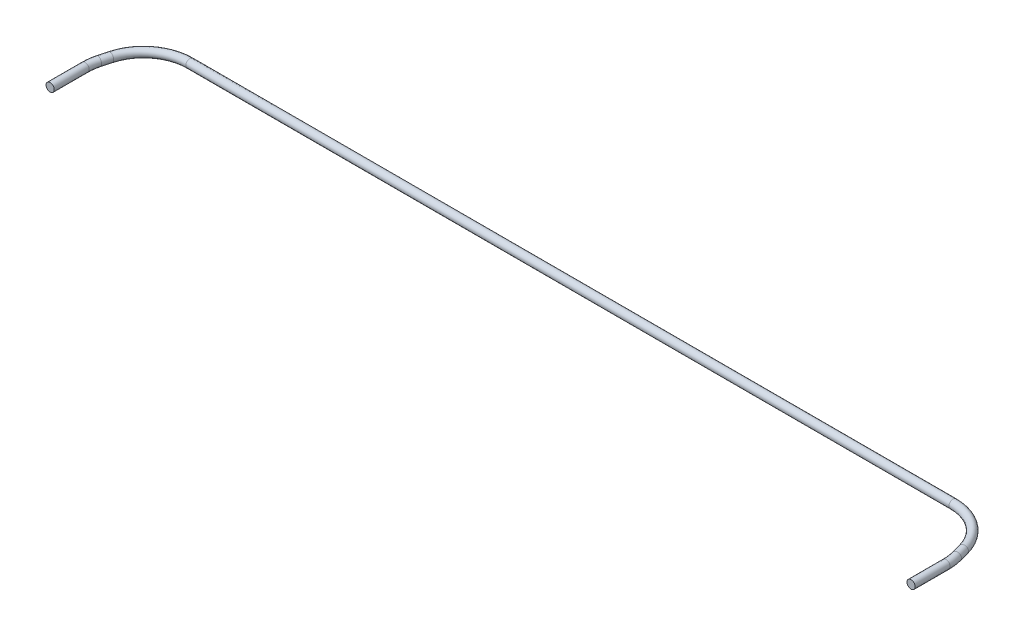
ISO-10303-21;
HEADER;
FILE_DESCRIPTION(('STEP AP214'),'2;1');
FILE_NAME('part.step','',(''),(''),'','','');
FILE_SCHEMA(('AUTOMOTIVE_DESIGN { 1 0 10303 214 1 1 1 1 }'));
ENDSEC;
DATA;
#1=APPLICATION_CONTEXT('core data for automotive mechanical design processes');
#2=APPLICATION_PROTOCOL_DEFINITION('international standard','automotive_design',2000,#1);
#3=PRODUCT_CONTEXT('',#1,'mechanical');
#4=PRODUCT('Part','Part','',(#3));
#5=PRODUCT_RELATED_PRODUCT_CATEGORY('part','',(#4));
#6=PRODUCT_DEFINITION_FORMATION('','',#4);
#7=PRODUCT_DEFINITION_CONTEXT('part definition',#1,'design');
#8=PRODUCT_DEFINITION('design','',#6,#7);
#9=PRODUCT_DEFINITION_SHAPE('','',#8);
#10=(LENGTH_UNIT() NAMED_UNIT(*) SI_UNIT(.MILLI.,.METRE.));
#11=(NAMED_UNIT(*) PLANE_ANGLE_UNIT() SI_UNIT($,.RADIAN.));
#12=(NAMED_UNIT(*) SI_UNIT($,.STERADIAN.) SOLID_ANGLE_UNIT());
#13=UNCERTAINTY_MEASURE_WITH_UNIT(LENGTH_MEASURE(1.E-05),#10,'distance_accuracy_value','');
#14=(GEOMETRIC_REPRESENTATION_CONTEXT(3) GLOBAL_UNCERTAINTY_ASSIGNED_CONTEXT((#13)) GLOBAL_UNIT_ASSIGNED_CONTEXT((#10,
#11,#12)) REPRESENTATION_CONTEXT('',''));
#15=CARTESIAN_POINT('',(0.,0.,0.));
#16=DIRECTION('',(0.,0.,1.));
#17=DIRECTION('',(1.,0.,0.));
#18=AXIS2_PLACEMENT_3D('',#15,#16,#17);
#19=CARTESIAN_POINT('',(135.392107577293,0.,26.));
#20=DIRECTION('',(0.,0.,1.));
#21=DIRECTION('',(1.,0.,0.));
#22=AXIS2_PLACEMENT_3D('',#19,#20,#21);
#23=PLANE('',#22);
#24=CARTESIAN_POINT('',(135.392107577293,0.,26.));
#25=DIRECTION('',(0.,0.,1.));
#26=DIRECTION('',(1.,0.,0.));
#27=AXIS2_PLACEMENT_3D('',#24,#25,#26);
#28=CIRCLE('',#27,1.29413);
#29=CARTESIAN_POINT('',(136.686237577293,0.,26.));
#30=VERTEX_POINT('',#29);
#31=EDGE_CURVE('E55',#30,#30,#28,.T.);
#32=ORIENTED_EDGE('',*,*,#31,.T.);
#33=EDGE_LOOP('',(#32));
#34=FACE_BOUND('',#33,.T.);
#35=ADVANCED_FACE('F36',(#34),#23,.T.);
#36=CARTESIAN_POINT('',(135.392107577293,0.,26.));
#37=DIRECTION('',(0.,0.,-1.));
#38=DIRECTION('',(-1.,0.,0.));
#39=AXIS2_PLACEMENT_3D('',#36,#37,#38);
#40=CYLINDRICAL_SURFACE('',#39,1.29413);
#41=CARTESIAN_POINT('',(135.392107577293,0.,15.));
#42=DIRECTION('',(0.,0.,1.));
#43=DIRECTION('',(1.,0.,0.));
#44=AXIS2_PLACEMENT_3D('',#41,#42,#43);
#45=CIRCLE('',#44,1.29413);
#46=CARTESIAN_POINT('',(136.686237577293,0.,15.));
#47=VERTEX_POINT('',#46);
#48=EDGE_CURVE('E50',#47,#47,#45,.T.);
#49=ORIENTED_EDGE('',*,*,#48,.T.);
#50=EDGE_LOOP('',(#49));
#51=FACE_BOUND('',#50,.T.);
#52=ORIENTED_EDGE('',*,*,#31,.F.);
#53=EDGE_LOOP('',(#52));
#54=FACE_BOUND('',#53,.T.);
#55=ADVANCED_FACE('F105',(#51,#54),#40,.T.);
#56=CARTESIAN_POINT('',(120.803847577293,0.,15.));
#57=DIRECTION('',(0.,1.,0.));
#58=DIRECTION('',(0.,0.,1.));
#59=AXIS2_PLACEMENT_3D('',#56,#57,#58);
#60=TOROIDAL_SURFACE('',#59,14.58826,1.29413);
#61=CARTESIAN_POINT('',(134.895024671913,0.,11.2242804770927));
#62=DIRECTION('',(0.258819045102518,0.,0.965925826289069));
#63=DIRECTION('',(0.965925826289069,0.,-0.258819045102518));
#64=AXIS2_PLACEMENT_3D('',#61,#62,#63);
#65=CIRCLE('',#64,1.29413);
#66=CARTESIAN_POINT('',(136.145058261489,0.,10.8893349862542));
#67=VERTEX_POINT('',#66);
#68=EDGE_CURVE('E46',#67,#67,#65,.T.);
#69=CARTESIAN_POINT('',(120.803847577293,0.,15.));
#70=DIRECTION('',(0.,1.,0.));
#71=DIRECTION('',(0.,0.,1.));
#72=AXIS2_PLACEMENT_3D('',#69,#70,#71);
#73=CIRCLE('',#72,15.88239);
#74=EDGE_CURVE('',#47,#67,#73,.T.);
#75=ORIENTED_EDGE('',*,*,#48,.F.);
#76=ORIENTED_EDGE('',*,*,#68,.T.);
#77=ORIENTED_EDGE('',*,*,#74,.T.);
#78=ORIENTED_EDGE('',*,*,#74,.F.);
#79=EDGE_LOOP('',(#75,#77,#76,#78));
#80=FACE_BOUND('',#79,.T.);
#81=ADVANCED_FACE('F102',(#80),#60,.T.);
#82=CARTESIAN_POINT('',(134.895024671913,0.,11.2242804770927));
#83=DIRECTION('',(-0.258819045102523,0.,-0.965925826289068));
#84=DIRECTION('',(-0.965925826289068,0.,0.258819045102523));
#85=AXIS2_PLACEMENT_3D('',#82,#83,#84);
#86=CYLINDRICAL_SURFACE('',#85,1.29413);
#87=CARTESIAN_POINT('',(134.09117709462,0.,8.22428047709274));
#88=DIRECTION('',(0.258819045102523,0.,0.965925826289068));
#89=DIRECTION('',(0.965925826289068,0.,-0.258819045102523));
#90=AXIS2_PLACEMENT_3D('',#87,#88,#89);
#91=CIRCLE('',#90,1.29413);
#92=CARTESIAN_POINT('',(135.341210684195,0.,7.88933498625422));
#93=VERTEX_POINT('',#92);
#94=EDGE_CURVE('E42',#93,#93,#91,.T.);
#95=ORIENTED_EDGE('',*,*,#94,.T.);
#96=EDGE_LOOP('',(#95));
#97=FACE_BOUND('',#96,.T.);
#98=ORIENTED_EDGE('',*,*,#68,.F.);
#99=EDGE_LOOP('',(#98));
#100=FACE_BOUND('',#99,.T.);
#101=ADVANCED_FACE('F96',(#97,#100),#86,.T.);
#102=CARTESIAN_POINT('',(120.,0.,12.));
#103=DIRECTION('',(0.,1.,0.));
#104=DIRECTION('',(0.,0.,1.));
#105=AXIS2_PLACEMENT_3D('',#102,#103,#104);
#106=TOROIDAL_SURFACE('',#105,14.58826,1.29413);
#107=CARTESIAN_POINT('',(120.,0.,-2.58826000000001));
#108=DIRECTION('',(1.,0.,0.));
#109=DIRECTION('',(0.,0.,-1.));
#110=AXIS2_PLACEMENT_3D('',#107,#108,#109);
#111=CIRCLE('',#110,1.29413);
#112=CARTESIAN_POINT('',(120.,0.,-3.88239000000001));
#113=VERTEX_POINT('',#112);
#114=EDGE_CURVE('E10',#113,#113,#111,.T.);
#115=CARTESIAN_POINT('',(120.,0.,12.));
#116=DIRECTION('',(0.,1.,0.));
#117=DIRECTION('',(0.,0.,1.));
#118=AXIS2_PLACEMENT_3D('',#115,#116,#117);
#119=CIRCLE('',#118,15.88239);
#120=EDGE_CURVE('',#93,#113,#119,.T.);
#121=ORIENTED_EDGE('',*,*,#94,.F.);
#122=ORIENTED_EDGE('',*,*,#114,.T.);
#123=ORIENTED_EDGE('',*,*,#120,.T.);
#124=ORIENTED_EDGE('',*,*,#120,.F.);
#125=EDGE_LOOP('',(#121,#123,#122,#124));
#126=FACE_BOUND('',#125,.T.);
#127=ADVANCED_FACE('F91',(#126),#106,.T.);
#128=CARTESIAN_POINT('',(120.,0.,-2.58826));
#129=DIRECTION('',(-1.,0.,0.));
#130=DIRECTION('',(0.,0.,1.));
#131=AXIS2_PLACEMENT_3D('',#128,#129,#130);
#132=CYLINDRICAL_SURFACE('',#131,1.29413);
#133=ORIENTED_EDGE('',*,*,#114,.F.);
#134=EDGE_LOOP('',(#133));
#135=FACE_BOUND('',#134,.T.);
#136=CARTESIAN_POINT('',(-120.,0.,-2.58826000000001));
#137=DIRECTION('',(1.,0.,0.));
#138=DIRECTION('',(0.,0.,-1.));
#139=AXIS2_PLACEMENT_3D('',#136,#137,#138);
#140=CIRCLE('',#139,1.29413);
#141=CARTESIAN_POINT('',(-120.,0.,-3.88239000000001));
#142=VERTEX_POINT('',#141);
#143=EDGE_CURVE('E58',#142,#142,#140,.F.);
#144=ORIENTED_EDGE('',*,*,#143,.F.);
#145=EDGE_LOOP('',(#144));
#146=FACE_BOUND('',#145,.T.);
#147=ADVANCED_FACE('F88',(#135,#146),#132,.T.);
#148=CARTESIAN_POINT('',(-135.392107577293,0.,26.));
#149=DIRECTION('',(0.,0.,1.));
#150=DIRECTION('',(-1.,0.,0.));
#151=AXIS2_PLACEMENT_3D('',#148,#149,#150);
#152=PLANE('',#151);
#153=CARTESIAN_POINT('',(-135.392107577293,0.,26.));
#154=DIRECTION('',(0.,0.,-1.));
#155=DIRECTION('',(-1.,0.,0.));
#156=AXIS2_PLACEMENT_3D('',#153,#154,#155);
#157=CIRCLE('',#156,1.29413);
#158=CARTESIAN_POINT('',(-136.686237577293,0.,26.));
#159=VERTEX_POINT('',#158);
#160=EDGE_CURVE('E70',#159,#159,#157,.F.);
#161=ORIENTED_EDGE('',*,*,#160,.T.);
#162=EDGE_LOOP('',(#161));
#163=FACE_BOUND('',#162,.T.);
#164=ADVANCED_FACE('F74',(#163),#152,.T.);
#165=CARTESIAN_POINT('',(-135.392107577293,0.,26.));
#166=DIRECTION('',(0.,0.,-1.));
#167=DIRECTION('',(-1.,0.,0.));
#168=AXIS2_PLACEMENT_3D('',#165,#166,#167);
#169=CYLINDRICAL_SURFACE('',#168,1.29413);
#170=CARTESIAN_POINT('',(-135.392107577293,0.,15.));
#171=DIRECTION('',(0.,0.,-1.));
#172=DIRECTION('',(-1.,0.,0.));
#173=AXIS2_PLACEMENT_3D('',#170,#171,#172);
#174=CIRCLE('',#173,1.29413);
#175=CARTESIAN_POINT('',(-136.686237577293,0.,15.));
#176=VERTEX_POINT('',#175);
#177=EDGE_CURVE('E67',#176,#176,#174,.F.);
#178=ORIENTED_EDGE('',*,*,#177,.T.);
#179=EDGE_LOOP('',(#178));
#180=FACE_BOUND('',#179,.T.);
#181=ORIENTED_EDGE('',*,*,#160,.F.);
#182=EDGE_LOOP('',(#181));
#183=FACE_BOUND('',#182,.T.);
#184=ADVANCED_FACE('F76',(#180,#183),#169,.T.);
#185=CARTESIAN_POINT('',(-120.803847577293,0.,15.));
#186=DIRECTION('',(0.,-1.,0.));
#187=DIRECTION('',(0.,0.,-1.));
#188=AXIS2_PLACEMENT_3D('',#185,#186,#187);
#189=TOROIDAL_SURFACE('',#188,14.58826,1.29413);
#190=CARTESIAN_POINT('',(-134.895024671913,0.,11.2242804770927));
#191=DIRECTION('',(0.258819045102518,0.,-0.965925826289069));
#192=DIRECTION('',(-0.965925826289069,0.,-0.258819045102518));
#193=AXIS2_PLACEMENT_3D('',#190,#191,#192);
#194=CIRCLE('',#193,1.29413);
#195=CARTESIAN_POINT('',(-136.145058261489,0.,10.8893349862542));
#196=VERTEX_POINT('',#195);
#197=EDGE_CURVE('E64',#196,#196,#194,.F.);
#198=CARTESIAN_POINT('',(-120.803847577293,0.,15.));
#199=DIRECTION('',(0.,-1.,0.));
#200=DIRECTION('',(0.,0.,-1.));
#201=AXIS2_PLACEMENT_3D('',#198,#199,#200);
#202=CIRCLE('',#201,15.88239);
#203=EDGE_CURVE('',#176,#196,#202,.T.);
#204=ORIENTED_EDGE('',*,*,#177,.F.);
#205=ORIENTED_EDGE('',*,*,#197,.T.);
#206=ORIENTED_EDGE('',*,*,#203,.T.);
#207=ORIENTED_EDGE('',*,*,#203,.F.);
#208=EDGE_LOOP('',(#204,#206,#205,#207));
#209=FACE_BOUND('',#208,.T.);
#210=ADVANCED_FACE('F78',(#209),#189,.T.);
#211=CARTESIAN_POINT('',(-134.895024671913,0.,11.2242804770927));
#212=DIRECTION('',(0.258819045102523,0.,-0.965925826289068));
#213=DIRECTION('',(-0.965925826289068,0.,-0.258819045102523));
#214=AXIS2_PLACEMENT_3D('',#211,#212,#213);
#215=CYLINDRICAL_SURFACE('',#214,1.29413);
#216=CARTESIAN_POINT('',(-134.09117709462,0.,8.22428047709274));
#217=DIRECTION('',(0.258819045102523,0.,-0.965925826289068));
#218=DIRECTION('',(-0.965925826289068,0.,-0.258819045102523));
#219=AXIS2_PLACEMENT_3D('',#216,#217,#218);
#220=CIRCLE('',#219,1.29413);
#221=CARTESIAN_POINT('',(-135.341210684195,0.,7.88933498625422));
#222=VERTEX_POINT('',#221);
#223=EDGE_CURVE('E61',#222,#222,#220,.F.);
#224=ORIENTED_EDGE('',*,*,#223,.T.);
#225=EDGE_LOOP('',(#224));
#226=FACE_BOUND('',#225,.T.);
#227=ORIENTED_EDGE('',*,*,#197,.F.);
#228=EDGE_LOOP('',(#227));
#229=FACE_BOUND('',#228,.T.);
#230=ADVANCED_FACE('F85',(#226,#229),#215,.T.);
#231=CARTESIAN_POINT('',(-120.,0.,12.));
#232=DIRECTION('',(0.,-1.,0.));
#233=DIRECTION('',(0.,0.,-1.));
#234=AXIS2_PLACEMENT_3D('',#231,#232,#233);
#235=TOROIDAL_SURFACE('',#234,14.58826,1.29413);
#236=CARTESIAN_POINT('',(-120.,0.,12.));
#237=DIRECTION('',(0.,-1.,0.));
#238=DIRECTION('',(0.,0.,-1.));
#239=AXIS2_PLACEMENT_3D('',#236,#237,#238);
#240=CIRCLE('',#239,15.88239);
#241=EDGE_CURVE('',#222,#142,#240,.T.);
#242=ORIENTED_EDGE('',*,*,#223,.F.);
#243=ORIENTED_EDGE('',*,*,#143,.T.);
#244=ORIENTED_EDGE('',*,*,#241,.T.);
#245=ORIENTED_EDGE('',*,*,#241,.F.);
#246=EDGE_LOOP('',(#242,#244,#243,#245));
#247=FACE_BOUND('',#246,.T.);
#248=ADVANCED_FACE('F110',(#247),#235,.T.);
#249=CLOSED_SHELL('',(#35,#55,#81,#101,#127,#147,#164,#184,#210,#230,#248));
#250=MANIFOLD_SOLID_BREP('B2',#249);
#251=ADVANCED_BREP_SHAPE_REPRESENTATION('',(#18,#250),#14);
#252=SHAPE_DEFINITION_REPRESENTATION(#9,#251);
ENDSEC;
END-ISO-10303-21;
